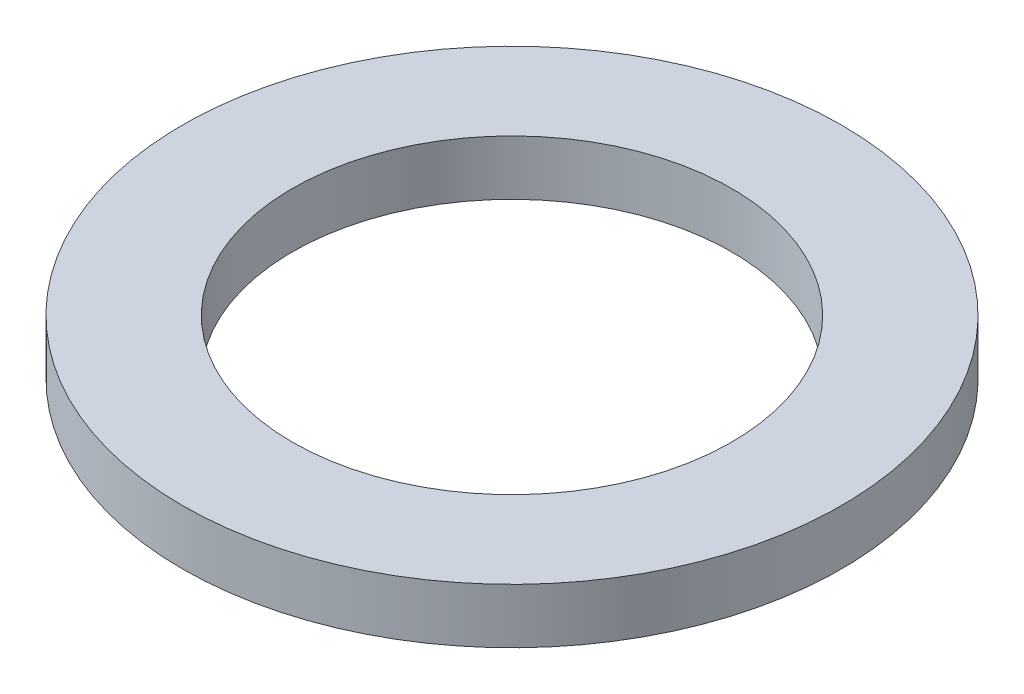
ISO-10303-21;
HEADER;
FILE_DESCRIPTION(('STEP AP214'),'2;1');
FILE_NAME('part.step','',(''),(''),'','','');
FILE_SCHEMA(('AUTOMOTIVE_DESIGN { 1 0 10303 214 1 1 1 1 }'));
ENDSEC;
DATA;
#1=APPLICATION_CONTEXT('core data for automotive mechanical design processes');
#2=APPLICATION_PROTOCOL_DEFINITION('international standard','automotive_design',2000,#1);
#3=PRODUCT_CONTEXT('',#1,'mechanical');
#4=PRODUCT('Part','Part','',(#3));
#5=PRODUCT_RELATED_PRODUCT_CATEGORY('part','',(#4));
#6=PRODUCT_DEFINITION_FORMATION('','',#4);
#7=PRODUCT_DEFINITION_CONTEXT('part definition',#1,'design');
#8=PRODUCT_DEFINITION('design','',#6,#7);
#9=PRODUCT_DEFINITION_SHAPE('','',#8);
#10=(LENGTH_UNIT() NAMED_UNIT(*) SI_UNIT(.MILLI.,.METRE.));
#11=(NAMED_UNIT(*) PLANE_ANGLE_UNIT() SI_UNIT($,.RADIAN.));
#12=(NAMED_UNIT(*) SI_UNIT($,.STERADIAN.) SOLID_ANGLE_UNIT());
#13=UNCERTAINTY_MEASURE_WITH_UNIT(LENGTH_MEASURE(1.E-05),#10,'distance_accuracy_value','');
#14=(GEOMETRIC_REPRESENTATION_CONTEXT(3) GLOBAL_UNCERTAINTY_ASSIGNED_CONTEXT((#13)) GLOBAL_UNIT_ASSIGNED_CONTEXT((#10,
#11,#12)) REPRESENTATION_CONTEXT('',''));
#15=CARTESIAN_POINT('',(0.,0.,0.));
#16=DIRECTION('',(0.,0.,1.));
#17=DIRECTION('',(1.,0.,0.));
#18=AXIS2_PLACEMENT_3D('',#15,#16,#17);
#19=CARTESIAN_POINT('',(0.,0.5,0.));
#20=DIRECTION('',(0.,1.,0.));
#21=DIRECTION('',(0.,0.,1.));
#22=AXIS2_PLACEMENT_3D('',#19,#20,#21);
#23=PLANE('',#22);
#24=CARTESIAN_POINT('',(0.,0.5,0.));
#25=DIRECTION('',(0.,1.,0.));
#26=DIRECTION('',(0.,0.,1.));
#27=AXIS2_PLACEMENT_3D('',#24,#25,#26);
#28=CIRCLE('',#27,3.);
#29=CARTESIAN_POINT('',(0.,0.5,3.));
#30=VERTEX_POINT('',#29);
#31=EDGE_CURVE('E10',#30,#30,#28,.T.);
#32=ORIENTED_EDGE('',*,*,#31,.T.);
#33=EDGE_LOOP('',(#32));
#34=FACE_BOUND('',#33,.T.);
#35=CARTESIAN_POINT('',(0.,0.5,0.));
#36=DIRECTION('',(0.,1.,0.));
#37=DIRECTION('',(0.,0.,1.));
#38=AXIS2_PLACEMENT_3D('',#35,#36,#37);
#39=CIRCLE('',#38,2.);
#40=CARTESIAN_POINT('',(0.,0.5,2.));
#41=VERTEX_POINT('',#40);
#42=EDGE_CURVE('E50',#41,#41,#39,.T.);
#43=ORIENTED_EDGE('',*,*,#42,.F.);
#44=EDGE_LOOP('',(#43));
#45=FACE_BOUND('',#44,.T.);
#46=ADVANCED_FACE('F39',(#34,#45),#23,.T.);
#47=CARTESIAN_POINT('',(0.,0.,0.));
#48=DIRECTION('',(0.,1.,0.));
#49=DIRECTION('',(0.,0.,1.));
#50=AXIS2_PLACEMENT_3D('',#47,#48,#49);
#51=PLANE('',#50);
#52=CARTESIAN_POINT('',(0.,0.,0.));
#53=DIRECTION('',(0.,1.,0.));
#54=DIRECTION('',(0.,0.,1.));
#55=AXIS2_PLACEMENT_3D('',#52,#53,#54);
#56=CIRCLE('',#55,3.);
#57=CARTESIAN_POINT('',(0.,0.,3.));
#58=VERTEX_POINT('',#57);
#59=EDGE_CURVE('E43',#58,#58,#56,.T.);
#60=ORIENTED_EDGE('',*,*,#59,.F.);
#61=EDGE_LOOP('',(#60));
#62=FACE_BOUND('',#61,.T.);
#63=CARTESIAN_POINT('',(0.,0.,0.));
#64=DIRECTION('',(0.,1.,0.));
#65=DIRECTION('',(0.,0.,1.));
#66=AXIS2_PLACEMENT_3D('',#63,#64,#65);
#67=CIRCLE('',#66,2.);
#68=CARTESIAN_POINT('',(0.,0.,2.));
#69=VERTEX_POINT('',#68);
#70=EDGE_CURVE('E52',#69,#69,#67,.T.);
#71=ORIENTED_EDGE('',*,*,#70,.T.);
#72=EDGE_LOOP('',(#71));
#73=FACE_BOUND('',#72,.T.);
#74=ADVANCED_FACE('F62',(#62,#73),#51,.F.);
#75=CARTESIAN_POINT('',(0.,0.5,0.));
#76=DIRECTION('',(0.,-1.,0.));
#77=DIRECTION('',(0.,0.,-1.));
#78=AXIS2_PLACEMENT_3D('',#75,#76,#77);
#79=CYLINDRICAL_SURFACE('',#78,3.);
#80=ORIENTED_EDGE('',*,*,#31,.F.);
#81=EDGE_LOOP('',(#80));
#82=FACE_BOUND('',#81,.T.);
#83=ORIENTED_EDGE('',*,*,#59,.T.);
#84=EDGE_LOOP('',(#83));
#85=FACE_BOUND('',#84,.T.);
#86=ADVANCED_FACE('F41',(#82,#85),#79,.T.);
#87=CARTESIAN_POINT('',(0.,0.5,0.));
#88=DIRECTION('',(0.,-1.,0.));
#89=DIRECTION('',(0.,0.,-1.));
#90=AXIS2_PLACEMENT_3D('',#87,#88,#89);
#91=CYLINDRICAL_SURFACE('',#90,2.);
#92=ORIENTED_EDGE('',*,*,#42,.T.);
#93=EDGE_LOOP('',(#92));
#94=FACE_BOUND('',#93,.T.);
#95=ORIENTED_EDGE('',*,*,#70,.F.);
#96=EDGE_LOOP('',(#95));
#97=FACE_BOUND('',#96,.T.);
#98=ADVANCED_FACE('F58',(#94,#97),#91,.F.);
#99=CLOSED_SHELL('',(#46,#74,#86,#98));
#100=MANIFOLD_SOLID_BREP('B2',#99);
#101=ADVANCED_BREP_SHAPE_REPRESENTATION('',(#18,#100),#14);
#102=SHAPE_DEFINITION_REPRESENTATION(#9,#101);
ENDSEC;
END-ISO-10303-21;
